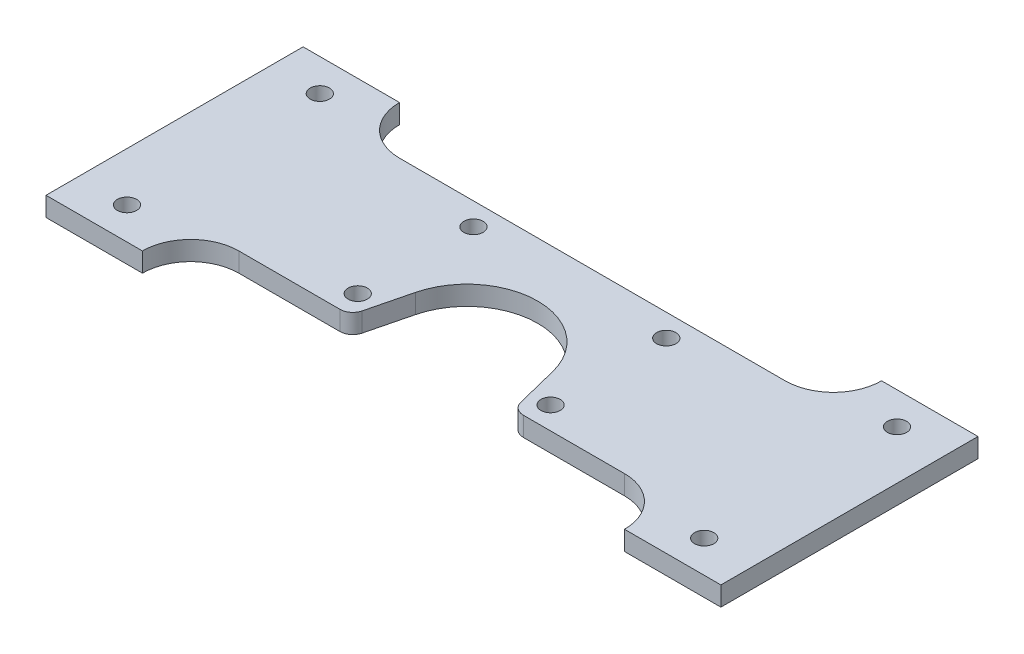
ISO-10303-21;
HEADER;
FILE_DESCRIPTION(('STEP AP214'),'2;1');
FILE_NAME('part.step','',(''),(''),'','','');
FILE_SCHEMA(('AUTOMOTIVE_DESIGN { 1 0 10303 214 1 1 1 1 }'));
ENDSEC;
DATA;
#1=APPLICATION_CONTEXT('core data for automotive mechanical design processes');
#2=APPLICATION_PROTOCOL_DEFINITION('international standard','automotive_design',2000,#1);
#3=PRODUCT_CONTEXT('',#1,'mechanical');
#4=PRODUCT('Part','Part','',(#3));
#5=PRODUCT_RELATED_PRODUCT_CATEGORY('part','',(#4));
#6=PRODUCT_DEFINITION_FORMATION('','',#4);
#7=PRODUCT_DEFINITION_CONTEXT('part definition',#1,'design');
#8=PRODUCT_DEFINITION('design','',#6,#7);
#9=PRODUCT_DEFINITION_SHAPE('','',#8);
#10=(LENGTH_UNIT() NAMED_UNIT(*) SI_UNIT(.MILLI.,.METRE.));
#11=(NAMED_UNIT(*) PLANE_ANGLE_UNIT() SI_UNIT($,.RADIAN.));
#12=(NAMED_UNIT(*) SI_UNIT($,.STERADIAN.) SOLID_ANGLE_UNIT());
#13=UNCERTAINTY_MEASURE_WITH_UNIT(LENGTH_MEASURE(1.E-05),#10,'distance_accuracy_value','');
#14=(GEOMETRIC_REPRESENTATION_CONTEXT(3) GLOBAL_UNCERTAINTY_ASSIGNED_CONTEXT((#13)) GLOBAL_UNIT_ASSIGNED_CONTEXT((#10,
#11,#12)) REPRESENTATION_CONTEXT('',''));
#15=CARTESIAN_POINT('',(0.,0.,0.));
#16=DIRECTION('',(0.,0.,1.));
#17=DIRECTION('',(1.,0.,0.));
#18=AXIS2_PLACEMENT_3D('',#15,#16,#17);
#19=CARTESIAN_POINT('',(-30.0000000000001,3.,-20.));
#20=DIRECTION('',(0.,1.,0.));
#21=DIRECTION('',(0.,0.,1.));
#22=AXIS2_PLACEMENT_3D('',#19,#20,#21);
#23=PLANE('',#22);
#24=CARTESIAN_POINT('',(-15.,3.,-9.));
#25=DIRECTION('',(0.,1.,0.));
#26=DIRECTION('',(0.,0.,1.));
#27=AXIS2_PLACEMENT_3D('',#24,#25,#26);
#28=CIRCLE('',#27,1.5);
#29=CARTESIAN_POINT('',(-15.,3.,-7.5));
#30=VERTEX_POINT('',#29);
#31=EDGE_CURVE('E348',#30,#30,#28,.T.);
#32=ORIENTED_EDGE('',*,*,#31,.F.);
#33=EDGE_LOOP('',(#32));
#34=FACE_BOUND('',#33,.T.);
#35=CARTESIAN_POINT('',(15.,3.,-9.));
#36=DIRECTION('',(0.,1.,0.));
#37=DIRECTION('',(0.,0.,1.));
#38=AXIS2_PLACEMENT_3D('',#35,#36,#37);
#39=CIRCLE('',#38,1.5);
#40=CARTESIAN_POINT('',(15.,3.,-7.5));
#41=VERTEX_POINT('',#40);
#42=EDGE_CURVE('E336',#41,#41,#39,.T.);
#43=ORIENTED_EDGE('',*,*,#42,.F.);
#44=EDGE_LOOP('',(#43));
#45=FACE_BOUND('',#44,.T.);
#46=CARTESIAN_POINT('',(44.9012806053458,3.,15.));
#47=DIRECTION('',(0.,1.,0.));
#48=DIRECTION('',(0.,0.,1.));
#49=AXIS2_PLACEMENT_3D('',#46,#47,#48);
#50=CIRCLE('',#49,1.5);
#51=CARTESIAN_POINT('',(44.9012806053458,3.,16.5));
#52=VERTEX_POINT('',#51);
#53=EDGE_CURVE('E324',#52,#52,#50,.T.);
#54=ORIENTED_EDGE('',*,*,#53,.F.);
#55=EDGE_LOOP('',(#54));
#56=FACE_BOUND('',#55,.T.);
#57=CARTESIAN_POINT('',(-44.9012806053458,3.,-15.));
#58=DIRECTION('',(0.,1.,0.));
#59=DIRECTION('',(0.,0.,1.));
#60=AXIS2_PLACEMENT_3D('',#57,#58,#59);
#61=CIRCLE('',#60,1.5);
#62=CARTESIAN_POINT('',(-44.9012806053458,3.,-13.5));
#63=VERTEX_POINT('',#62);
#64=EDGE_CURVE('E290',#63,#63,#61,.T.);
#65=ORIENTED_EDGE('',*,*,#64,.F.);
#66=EDGE_LOOP('',(#65));
#67=FACE_BOUND('',#66,.T.);
#68=DIRECTION('',(0.241921895599665,0.,0.970295726275997));
#69=VECTOR('',#68,1.);
#70=CARTESIAN_POINT('',(10.673252989036,3.,4.33885914840369));
#71=LINE('',#70,#69);
#72=CARTESIAN_POINT('',(10.673252989036,3.,4.33885914840368));
#73=VERTEX_POINT('',#72);
#74=CARTESIAN_POINT('',(12.3300337389478,3.,10.9838437911993));
#75=VERTEX_POINT('',#74);
#76=EDGE_CURVE('E306',#73,#75,#71,.T.);
#77=ORIENTED_EDGE('',*,*,#76,.T.);
#78=CARTESIAN_POINT('',(14.2706251914998,3.,10.5));
#79=DIRECTION('',(0.,1.,0.));
#80=DIRECTION('',(0.,0.,1.));
#81=AXIS2_PLACEMENT_3D('',#78,#79,#80);
#82=CIRCLE('',#81,2.);
#83=CARTESIAN_POINT('',(14.2706251914998,3.,12.5));
#84=VERTEX_POINT('',#83);
#85=EDGE_CURVE('E200',#75,#84,#82,.T.);
#86=ORIENTED_EDGE('',*,*,#85,.T.);
#87=DIRECTION('',(1.,0.,0.));
#88=VECTOR('',#87,1.);
#89=CARTESIAN_POINT('',(12.7080539384863,3.,12.5));
#90=LINE('',#89,#88);
#91=CARTESIAN_POINT('',(30.0000000000001,3.,12.5));
#92=VERTEX_POINT('',#91);
#93=EDGE_CURVE('E304',#84,#92,#90,.T.);
#94=ORIENTED_EDGE('',*,*,#93,.T.);
#95=CARTESIAN_POINT('',(30.0000000000001,3.,19.9999999999999));
#96=DIRECTION('',(0.,-1.,0.));
#97=DIRECTION('',(0.,0.,-1.));
#98=AXIS2_PLACEMENT_3D('',#95,#96,#97);
#99=CIRCLE('',#98,7.49999999999992);
#100=CARTESIAN_POINT('',(37.5,3.,19.9999999999999));
#101=VERTEX_POINT('',#100);
#102=EDGE_CURVE('E302',#92,#101,#99,.T.);
#103=ORIENTED_EDGE('',*,*,#102,.T.);
#104=DIRECTION('',(1.,0.,0.));
#105=VECTOR('',#104,1.);
#106=CARTESIAN_POINT('',(37.5,3.,19.9999999999999));
#107=LINE('',#106,#105);
#108=CARTESIAN_POINT('',(52.5,3.,20.));
#109=VERTEX_POINT('',#108);
#110=EDGE_CURVE('E300',#101,#109,#107,.T.);
#111=ORIENTED_EDGE('',*,*,#110,.T.);
#112=DIRECTION('',(0.,0.,-1.));
#113=VECTOR('',#112,1.);
#114=CARTESIAN_POINT('',(52.5,3.,20.));
#115=LINE('',#114,#113);
#116=CARTESIAN_POINT('',(52.5,3.,-20.0000000000001));
#117=VERTEX_POINT('',#116);
#118=EDGE_CURVE('E298',#109,#117,#115,.T.);
#119=ORIENTED_EDGE('',*,*,#118,.T.);
#120=DIRECTION('',(-1.,0.,0.));
#121=VECTOR('',#120,1.);
#122=CARTESIAN_POINT('',(37.5,3.,-19.9999999999999));
#123=LINE('',#122,#121);
#124=CARTESIAN_POINT('',(37.5,3.,-19.9999999999999));
#125=VERTEX_POINT('',#124);
#126=EDGE_CURVE('E296',#117,#125,#123,.T.);
#127=ORIENTED_EDGE('',*,*,#126,.T.);
#128=CARTESIAN_POINT('',(30.0000000000001,3.,-19.9999999999999));
#129=DIRECTION('',(0.,-1.,0.));
#130=DIRECTION('',(0.,0.,1.));
#131=AXIS2_PLACEMENT_3D('',#128,#129,#130);
#132=CIRCLE('',#131,7.49999999999995);
#133=CARTESIAN_POINT('',(30.0000000000001,3.,-12.5));
#134=VERTEX_POINT('',#133);
#135=EDGE_CURVE('E294',#125,#134,#132,.T.);
#136=ORIENTED_EDGE('',*,*,#135,.T.);
#137=DIRECTION('',(-1.,0.,0.));
#138=VECTOR('',#137,1.);
#139=CARTESIAN_POINT('',(-30.0000000000001,3.,-12.5));
#140=LINE('',#139,#138);
#141=CARTESIAN_POINT('',(-30.0000000000001,3.,-12.5));
#142=VERTEX_POINT('',#141);
#143=EDGE_CURVE('E292',#134,#142,#140,.T.);
#144=ORIENTED_EDGE('',*,*,#143,.T.);
#145=CARTESIAN_POINT('',(-30.0000000000001,3.,-20.));
#146=DIRECTION('',(0.,-1.,0.));
#147=DIRECTION('',(0.,0.,1.));
#148=AXIS2_PLACEMENT_3D('',#145,#146,#147);
#149=CIRCLE('',#148,7.49999999999997);
#150=CARTESIAN_POINT('',(-37.5000000000001,3.,-19.9999999999999));
#151=VERTEX_POINT('',#150);
#152=EDGE_CURVE('E176',#142,#151,#149,.T.);
#153=ORIENTED_EDGE('',*,*,#152,.T.);
#154=DIRECTION('',(-1.,0.,0.));
#155=VECTOR('',#154,1.);
#156=CARTESIAN_POINT('',(-52.5,3.,-20.0000000000001));
#157=LINE('',#156,#155);
#158=CARTESIAN_POINT('',(-52.5,3.,-20.0000000000001));
#159=VERTEX_POINT('',#158);
#160=EDGE_CURVE('E170',#151,#159,#157,.T.);
#161=ORIENTED_EDGE('',*,*,#160,.T.);
#162=DIRECTION('',(0.,0.,1.));
#163=VECTOR('',#162,1.);
#164=CARTESIAN_POINT('',(-52.5,3.,-20.0000000000001));
#165=LINE('',#164,#163);
#166=CARTESIAN_POINT('',(-52.5,3.,19.9999999999999));
#167=VERTEX_POINT('',#166);
#168=EDGE_CURVE('E160',#159,#167,#165,.T.);
#169=ORIENTED_EDGE('',*,*,#168,.T.);
#170=DIRECTION('',(1.,0.,0.));
#171=VECTOR('',#170,1.);
#172=CARTESIAN_POINT('',(-52.5,3.,19.9999999999999));
#173=LINE('',#172,#171);
#174=CARTESIAN_POINT('',(-37.5,3.,19.9999999999999));
#175=VERTEX_POINT('',#174);
#176=EDGE_CURVE('E169',#167,#175,#173,.T.);
#177=ORIENTED_EDGE('',*,*,#176,.T.);
#178=CARTESIAN_POINT('',(-30.0000000000001,3.,19.9999999999999));
#179=DIRECTION('',(0.,-1.,0.));
#180=DIRECTION('',(0.,0.,-1.));
#181=AXIS2_PLACEMENT_3D('',#178,#179,#180);
#182=CIRCLE('',#181,7.49999999999992);
#183=CARTESIAN_POINT('',(-30.0000000000001,3.,12.5));
#184=VERTEX_POINT('',#183);
#185=EDGE_CURVE('E281',#175,#184,#182,.T.);
#186=ORIENTED_EDGE('',*,*,#185,.T.);
#187=DIRECTION('',(1.,0.,0.));
#188=VECTOR('',#187,1.);
#189=CARTESIAN_POINT('',(-30.0000000000001,3.,12.5));
#190=LINE('',#189,#188);
#191=CARTESIAN_POINT('',(-14.2706251914998,3.,12.5));
#192=VERTEX_POINT('',#191);
#193=EDGE_CURVE('E311',#184,#192,#190,.T.);
#194=ORIENTED_EDGE('',*,*,#193,.T.);
#195=CARTESIAN_POINT('',(-14.2706251914998,3.,10.5));
#196=DIRECTION('',(0.,1.,0.));
#197=DIRECTION('',(0.,0.,1.));
#198=AXIS2_PLACEMENT_3D('',#195,#196,#197);
#199=CIRCLE('',#198,2.);
#200=CARTESIAN_POINT('',(-12.3300337389478,3.,10.9838437911993));
#201=VERTEX_POINT('',#200);
#202=EDGE_CURVE('E50',#192,#201,#199,.T.);
#203=ORIENTED_EDGE('',*,*,#202,.T.);
#204=DIRECTION('',(0.241921895599665,0.,-0.970295726275997));
#205=VECTOR('',#204,1.);
#206=CARTESIAN_POINT('',(-12.7080539384863,3.,12.5));
#207=LINE('',#206,#205);
#208=CARTESIAN_POINT('',(-10.673252989036,3.,4.33885914840369));
#209=VERTEX_POINT('',#208);
#210=EDGE_CURVE('E209',#201,#209,#207,.T.);
#211=ORIENTED_EDGE('',*,*,#210,.T.);
#212=CARTESIAN_POINT('',(0.,3.,7.));
#213=DIRECTION('',(0.,-1.,0.));
#214=DIRECTION('',(0.,0.,-1.));
#215=AXIS2_PLACEMENT_3D('',#212,#213,#214);
#216=CIRCLE('',#215,11.);
#217=EDGE_CURVE('E308',#209,#73,#216,.T.);
#218=ORIENTED_EDGE('',*,*,#217,.T.);
#219=EDGE_LOOP('',(#77,#86,#94,#103,#111,#119,#127,#136,#144,#153,#161,#169,#177,#186,#194,#203,
#211,#218));
#220=FACE_BOUND('',#219,.T.);
#221=CARTESIAN_POINT('',(-44.9012806053458,3.,15.));
#222=DIRECTION('',(0.,1.,0.));
#223=DIRECTION('',(0.,0.,1.));
#224=AXIS2_PLACEMENT_3D('',#221,#222,#223);
#225=CIRCLE('',#224,1.5);
#226=CARTESIAN_POINT('',(-44.9012806053458,3.,16.5));
#227=VERTEX_POINT('',#226);
#228=EDGE_CURVE('E318',#227,#227,#225,.T.);
#229=ORIENTED_EDGE('',*,*,#228,.F.);
#230=EDGE_LOOP('',(#229));
#231=FACE_BOUND('',#230,.T.);
#232=CARTESIAN_POINT('',(44.9012806053458,3.,-15.));
#233=DIRECTION('',(0.,1.,0.));
#234=DIRECTION('',(0.,0.,1.));
#235=AXIS2_PLACEMENT_3D('',#232,#233,#234);
#236=CIRCLE('',#235,1.5);
#237=CARTESIAN_POINT('',(44.9012806053458,3.,-13.5));
#238=VERTEX_POINT('',#237);
#239=EDGE_CURVE('E330',#238,#238,#236,.T.);
#240=ORIENTED_EDGE('',*,*,#239,.F.);
#241=EDGE_LOOP('',(#240));
#242=FACE_BOUND('',#241,.T.);
#243=CARTESIAN_POINT('',(15.,3.,9.));
#244=DIRECTION('',(0.,1.,0.));
#245=DIRECTION('',(0.,0.,1.));
#246=AXIS2_PLACEMENT_3D('',#243,#244,#245);
#247=CIRCLE('',#246,1.5);
#248=CARTESIAN_POINT('',(15.,3.,10.5));
#249=VERTEX_POINT('',#248);
#250=EDGE_CURVE('E342',#249,#249,#247,.T.);
#251=ORIENTED_EDGE('',*,*,#250,.F.);
#252=EDGE_LOOP('',(#251));
#253=FACE_BOUND('',#252,.T.);
#254=CARTESIAN_POINT('',(-15.,3.,9.));
#255=DIRECTION('',(0.,1.,0.));
#256=DIRECTION('',(0.,0.,1.));
#257=AXIS2_PLACEMENT_3D('',#254,#255,#256);
#258=CIRCLE('',#257,1.5);
#259=CARTESIAN_POINT('',(-15.,3.,10.5));
#260=VERTEX_POINT('',#259);
#261=EDGE_CURVE('E354',#260,#260,#258,.T.);
#262=ORIENTED_EDGE('',*,*,#261,.F.);
#263=EDGE_LOOP('',(#262));
#264=FACE_BOUND('',#263,.T.);
#265=ADVANCED_FACE('F35',(#34,#45,#56,#67,#220,#231,#242,#253,#264),#23,.T.);
#266=CARTESIAN_POINT('',(-30.0000000000001,0.,-20.));
#267=DIRECTION('',(0.,1.,0.));
#268=DIRECTION('',(0.,0.,1.));
#269=AXIS2_PLACEMENT_3D('',#266,#267,#268);
#270=PLANE('',#269);
#271=DIRECTION('',(1.,0.,0.));
#272=VECTOR('',#271,1.);
#273=CARTESIAN_POINT('',(12.7080539384863,0.,12.5));
#274=LINE('',#273,#272);
#275=CARTESIAN_POINT('',(14.2706251914998,0.,12.5));
#276=VERTEX_POINT('',#275);
#277=CARTESIAN_POINT('',(30.0000000000001,0.,12.5));
#278=VERTEX_POINT('',#277);
#279=EDGE_CURVE('E229',#276,#278,#274,.T.);
#280=ORIENTED_EDGE('',*,*,#279,.F.);
#281=CARTESIAN_POINT('',(14.2706251914998,0.,10.5));
#282=DIRECTION('',(0.,1.,0.));
#283=DIRECTION('',(0.,0.,1.));
#284=AXIS2_PLACEMENT_3D('',#281,#282,#283);
#285=CIRCLE('',#284,2.);
#286=CARTESIAN_POINT('',(12.3300337389478,0.,10.9838437911993));
#287=VERTEX_POINT('',#286);
#288=EDGE_CURVE('E195',#276,#287,#285,.F.);
#289=ORIENTED_EDGE('',*,*,#288,.T.);
#290=DIRECTION('',(0.241921895599665,0.,0.970295726275997));
#291=VECTOR('',#290,1.);
#292=CARTESIAN_POINT('',(10.673252989036,0.,4.33885914840369));
#293=LINE('',#292,#291);
#294=CARTESIAN_POINT('',(10.673252989036,0.,4.33885914840368));
#295=VERTEX_POINT('',#294);
#296=EDGE_CURVE('E221',#295,#287,#293,.T.);
#297=ORIENTED_EDGE('',*,*,#296,.F.);
#298=CARTESIAN_POINT('',(0.,0.,7.));
#299=DIRECTION('',(0.,-1.,0.));
#300=DIRECTION('',(0.,0.,-1.));
#301=AXIS2_PLACEMENT_3D('',#298,#299,#300);
#302=CIRCLE('',#301,11.);
#303=CARTESIAN_POINT('',(-10.673252989036,0.,4.33885914840369));
#304=VERTEX_POINT('',#303);
#305=EDGE_CURVE('E218',#304,#295,#302,.T.);
#306=ORIENTED_EDGE('',*,*,#305,.F.);
#307=DIRECTION('',(0.241921895599665,0.,-0.970295726275997));
#308=VECTOR('',#307,1.);
#309=CARTESIAN_POINT('',(-12.7080539384863,0.,12.5));
#310=LINE('',#309,#308);
#311=CARTESIAN_POINT('',(-12.3300337389478,0.,10.9838437911993));
#312=VERTEX_POINT('',#311);
#313=EDGE_CURVE('E207',#312,#304,#310,.T.);
#314=ORIENTED_EDGE('',*,*,#313,.F.);
#315=CARTESIAN_POINT('',(-14.2706251914998,0.,10.5));
#316=DIRECTION('',(0.,1.,0.));
#317=DIRECTION('',(0.,0.,1.));
#318=AXIS2_PLACEMENT_3D('',#315,#316,#317);
#319=CIRCLE('',#318,2.);
#320=CARTESIAN_POINT('',(-14.2706251914998,0.,12.5));
#321=VERTEX_POINT('',#320);
#322=EDGE_CURVE('E188',#312,#321,#319,.F.);
#323=ORIENTED_EDGE('',*,*,#322,.T.);
#324=DIRECTION('',(1.,0.,0.));
#325=VECTOR('',#324,1.);
#326=CARTESIAN_POINT('',(-30.0000000000001,0.,12.5));
#327=LINE('',#326,#325);
#328=CARTESIAN_POINT('',(-30.0000000000001,0.,12.5));
#329=VERTEX_POINT('',#328);
#330=EDGE_CURVE('E219',#329,#321,#327,.T.);
#331=ORIENTED_EDGE('',*,*,#330,.F.);
#332=CARTESIAN_POINT('',(-30.0000000000001,0.,19.9999999999999));
#333=DIRECTION('',(0.,-1.,0.));
#334=DIRECTION('',(0.,0.,-1.));
#335=AXIS2_PLACEMENT_3D('',#332,#333,#334);
#336=CIRCLE('',#335,7.49999999999992);
#337=CARTESIAN_POINT('',(-37.5,0.,19.9999999999999));
#338=VERTEX_POINT('',#337);
#339=EDGE_CURVE('E223',#338,#329,#336,.T.);
#340=ORIENTED_EDGE('',*,*,#339,.F.);
#341=DIRECTION('',(1.,0.,0.));
#342=VECTOR('',#341,1.);
#343=CARTESIAN_POINT('',(-52.5,0.,19.9999999999999));
#344=LINE('',#343,#342);
#345=CARTESIAN_POINT('',(-52.5,0.,19.9999999999999));
#346=VERTEX_POINT('',#345);
#347=EDGE_CURVE('E284',#346,#338,#344,.T.);
#348=ORIENTED_EDGE('',*,*,#347,.F.);
#349=DIRECTION('',(0.,0.,1.));
#350=VECTOR('',#349,1.);
#351=CARTESIAN_POINT('',(-52.5,0.,-20.0000000000001));
#352=LINE('',#351,#350);
#353=CARTESIAN_POINT('',(-52.5,0.,-20.0000000000001));
#354=VERTEX_POINT('',#353);
#355=EDGE_CURVE('E285',#354,#346,#352,.T.);
#356=ORIENTED_EDGE('',*,*,#355,.F.);
#357=DIRECTION('',(-1.,0.,0.));
#358=VECTOR('',#357,1.);
#359=CARTESIAN_POINT('',(-52.5,0.,-20.0000000000001));
#360=LINE('',#359,#358);
#361=CARTESIAN_POINT('',(-37.5000000000001,0.,-19.9999999999999));
#362=VERTEX_POINT('',#361);
#363=EDGE_CURVE('E184',#362,#354,#360,.T.);
#364=ORIENTED_EDGE('',*,*,#363,.F.);
#365=CARTESIAN_POINT('',(-30.0000000000001,0.,-20.));
#366=DIRECTION('',(0.,-1.,0.));
#367=DIRECTION('',(0.,0.,1.));
#368=AXIS2_PLACEMENT_3D('',#365,#366,#367);
#369=CIRCLE('',#368,7.49999999999997);
#370=CARTESIAN_POINT('',(-30.0000000000001,0.,-12.5));
#371=VERTEX_POINT('',#370);
#372=EDGE_CURVE('E180',#371,#362,#369,.T.);
#373=ORIENTED_EDGE('',*,*,#372,.F.);
#374=DIRECTION('',(-1.,0.,0.));
#375=VECTOR('',#374,1.);
#376=CARTESIAN_POINT('',(-30.0000000000001,0.,-12.5));
#377=LINE('',#376,#375);
#378=CARTESIAN_POINT('',(30.0000000000001,0.,-12.5));
#379=VERTEX_POINT('',#378);
#380=EDGE_CURVE('E241',#379,#371,#377,.T.);
#381=ORIENTED_EDGE('',*,*,#380,.F.);
#382=CARTESIAN_POINT('',(30.0000000000001,0.,-19.9999999999999));
#383=DIRECTION('',(0.,-1.,0.));
#384=DIRECTION('',(0.,0.,1.));
#385=AXIS2_PLACEMENT_3D('',#382,#383,#384);
#386=CIRCLE('',#385,7.49999999999995);
#387=CARTESIAN_POINT('',(37.5,0.,-19.9999999999999));
#388=VERTEX_POINT('',#387);
#389=EDGE_CURVE('E239',#388,#379,#386,.T.);
#390=ORIENTED_EDGE('',*,*,#389,.F.);
#391=DIRECTION('',(-1.,0.,0.));
#392=VECTOR('',#391,1.);
#393=CARTESIAN_POINT('',(37.5,0.,-19.9999999999999));
#394=LINE('',#393,#392);
#395=CARTESIAN_POINT('',(52.5,0.,-20.0000000000001));
#396=VERTEX_POINT('',#395);
#397=EDGE_CURVE('E237',#396,#388,#394,.T.);
#398=ORIENTED_EDGE('',*,*,#397,.F.);
#399=DIRECTION('',(0.,0.,-1.));
#400=VECTOR('',#399,1.);
#401=CARTESIAN_POINT('',(52.5,0.,20.));
#402=LINE('',#401,#400);
#403=CARTESIAN_POINT('',(52.5,0.,20.));
#404=VERTEX_POINT('',#403);
#405=EDGE_CURVE('E235',#404,#396,#402,.T.);
#406=ORIENTED_EDGE('',*,*,#405,.F.);
#407=DIRECTION('',(1.,0.,0.));
#408=VECTOR('',#407,1.);
#409=CARTESIAN_POINT('',(37.5,0.,19.9999999999999));
#410=LINE('',#409,#408);
#411=CARTESIAN_POINT('',(37.5,0.,19.9999999999999));
#412=VERTEX_POINT('',#411);
#413=EDGE_CURVE('E233',#412,#404,#410,.T.);
#414=ORIENTED_EDGE('',*,*,#413,.F.);
#415=CARTESIAN_POINT('',(30.0000000000001,0.,19.9999999999999));
#416=DIRECTION('',(0.,-1.,0.));
#417=DIRECTION('',(0.,0.,-1.));
#418=AXIS2_PLACEMENT_3D('',#415,#416,#417);
#419=CIRCLE('',#418,7.49999999999992);
#420=EDGE_CURVE('E231',#278,#412,#419,.T.);
#421=ORIENTED_EDGE('',*,*,#420,.F.);
#422=EDGE_LOOP('',(#280,#289,#297,#306,#314,#323,#331,#340,#348,#356,#364,#373,#381,#390,#398,
#406,#414,#421));
#423=FACE_BOUND('',#422,.T.);
#424=CARTESIAN_POINT('',(-44.9012806053458,0.,-15.));
#425=DIRECTION('',(0.,1.,0.));
#426=DIRECTION('',(0.,0.,1.));
#427=AXIS2_PLACEMENT_3D('',#424,#425,#426);
#428=CIRCLE('',#427,1.5);
#429=CARTESIAN_POINT('',(-44.9012806053458,0.,-13.5));
#430=VERTEX_POINT('',#429);
#431=EDGE_CURVE('E315',#430,#430,#428,.T.);
#432=ORIENTED_EDGE('',*,*,#431,.T.);
#433=EDGE_LOOP('',(#432));
#434=FACE_BOUND('',#433,.T.);
#435=CARTESIAN_POINT('',(-44.9012806053458,0.,15.));
#436=DIRECTION('',(0.,1.,0.));
#437=DIRECTION('',(0.,0.,1.));
#438=AXIS2_PLACEMENT_3D('',#435,#436,#437);
#439=CIRCLE('',#438,1.5);
#440=CARTESIAN_POINT('',(-44.9012806053458,0.,16.5));
#441=VERTEX_POINT('',#440);
#442=EDGE_CURVE('E321',#441,#441,#439,.T.);
#443=ORIENTED_EDGE('',*,*,#442,.T.);
#444=EDGE_LOOP('',(#443));
#445=FACE_BOUND('',#444,.T.);
#446=CARTESIAN_POINT('',(44.9012806053458,0.,15.));
#447=DIRECTION('',(0.,1.,0.));
#448=DIRECTION('',(0.,0.,1.));
#449=AXIS2_PLACEMENT_3D('',#446,#447,#448);
#450=CIRCLE('',#449,1.5);
#451=CARTESIAN_POINT('',(44.9012806053458,0.,16.5));
#452=VERTEX_POINT('',#451);
#453=EDGE_CURVE('E327',#452,#452,#450,.T.);
#454=ORIENTED_EDGE('',*,*,#453,.T.);
#455=EDGE_LOOP('',(#454));
#456=FACE_BOUND('',#455,.T.);
#457=CARTESIAN_POINT('',(44.9012806053458,0.,-15.));
#458=DIRECTION('',(0.,1.,0.));
#459=DIRECTION('',(0.,0.,1.));
#460=AXIS2_PLACEMENT_3D('',#457,#458,#459);
#461=CIRCLE('',#460,1.5);
#462=CARTESIAN_POINT('',(44.9012806053458,0.,-13.5));
#463=VERTEX_POINT('',#462);
#464=EDGE_CURVE('E333',#463,#463,#461,.T.);
#465=ORIENTED_EDGE('',*,*,#464,.T.);
#466=EDGE_LOOP('',(#465));
#467=FACE_BOUND('',#466,.T.);
#468=CARTESIAN_POINT('',(15.,0.,-9.));
#469=DIRECTION('',(0.,1.,0.));
#470=DIRECTION('',(0.,0.,1.));
#471=AXIS2_PLACEMENT_3D('',#468,#469,#470);
#472=CIRCLE('',#471,1.5);
#473=CARTESIAN_POINT('',(15.,0.,-7.5));
#474=VERTEX_POINT('',#473);
#475=EDGE_CURVE('E339',#474,#474,#472,.T.);
#476=ORIENTED_EDGE('',*,*,#475,.T.);
#477=EDGE_LOOP('',(#476));
#478=FACE_BOUND('',#477,.T.);
#479=CARTESIAN_POINT('',(15.,0.,9.));
#480=DIRECTION('',(0.,1.,0.));
#481=DIRECTION('',(0.,0.,1.));
#482=AXIS2_PLACEMENT_3D('',#479,#480,#481);
#483=CIRCLE('',#482,1.5);
#484=CARTESIAN_POINT('',(15.,0.,10.5));
#485=VERTEX_POINT('',#484);
#486=EDGE_CURVE('E345',#485,#485,#483,.T.);
#487=ORIENTED_EDGE('',*,*,#486,.T.);
#488=EDGE_LOOP('',(#487));
#489=FACE_BOUND('',#488,.T.);
#490=CARTESIAN_POINT('',(-15.,0.,-9.));
#491=DIRECTION('',(0.,1.,0.));
#492=DIRECTION('',(0.,0.,1.));
#493=AXIS2_PLACEMENT_3D('',#490,#491,#492);
#494=CIRCLE('',#493,1.5);
#495=CARTESIAN_POINT('',(-15.,0.,-7.5));
#496=VERTEX_POINT('',#495);
#497=EDGE_CURVE('E351',#496,#496,#494,.T.);
#498=ORIENTED_EDGE('',*,*,#497,.T.);
#499=EDGE_LOOP('',(#498));
#500=FACE_BOUND('',#499,.T.);
#501=CARTESIAN_POINT('',(-15.,0.,9.));
#502=DIRECTION('',(0.,1.,0.));
#503=DIRECTION('',(0.,0.,1.));
#504=AXIS2_PLACEMENT_3D('',#501,#502,#503);
#505=CIRCLE('',#504,1.5);
#506=CARTESIAN_POINT('',(-15.,0.,10.5));
#507=VERTEX_POINT('',#506);
#508=EDGE_CURVE('E357',#507,#507,#505,.T.);
#509=ORIENTED_EDGE('',*,*,#508,.T.);
#510=EDGE_LOOP('',(#509));
#511=FACE_BOUND('',#510,.T.);
#512=ADVANCED_FACE('F214',(#423,#434,#445,#456,#467,#478,#489,#500,#511),#270,.F.);
#513=CARTESIAN_POINT('',(-52.5,3.,-20.0000000000001));
#514=DIRECTION('',(0.,0.,1.));
#515=DIRECTION('',(1.,0.,0.));
#516=AXIS2_PLACEMENT_3D('',#513,#514,#515);
#517=PLANE('',#516);
#518=ORIENTED_EDGE('',*,*,#363,.T.);
#519=DIRECTION('',(0.,-1.,0.));
#520=VECTOR('',#519,1.);
#521=CARTESIAN_POINT('',(-52.5,3.,-20.0000000000001));
#522=LINE('',#521,#520);
#523=EDGE_CURVE('E164',#159,#354,#522,.T.);
#524=ORIENTED_EDGE('',*,*,#523,.F.);
#525=ORIENTED_EDGE('',*,*,#160,.F.);
#526=DIRECTION('',(0.,-1.,0.));
#527=VECTOR('',#526,1.);
#528=CARTESIAN_POINT('',(-37.5000000000001,3.,-19.9999999999999));
#529=LINE('',#528,#527);
#530=EDGE_CURVE('E244',#151,#362,#529,.T.);
#531=ORIENTED_EDGE('',*,*,#530,.T.);
#532=EDGE_LOOP('',(#518,#524,#525,#531));
#533=FACE_BOUND('',#532,.T.);
#534=ADVANCED_FACE('F182',(#533),#517,.F.);
#535=CARTESIAN_POINT('',(-52.5,3.,-20.0000000000001));
#536=DIRECTION('',(1.,0.,0.));
#537=DIRECTION('',(0.,0.,-1.));
#538=AXIS2_PLACEMENT_3D('',#535,#536,#537);
#539=PLANE('',#538);
#540=ORIENTED_EDGE('',*,*,#355,.T.);
#541=DIRECTION('',(0.,-1.,0.));
#542=VECTOR('',#541,1.);
#543=CARTESIAN_POINT('',(-52.5,3.,19.9999999999999));
#544=LINE('',#543,#542);
#545=EDGE_CURVE('E167',#167,#346,#544,.T.);
#546=ORIENTED_EDGE('',*,*,#545,.F.);
#547=ORIENTED_EDGE('',*,*,#168,.F.);
#548=ORIENTED_EDGE('',*,*,#523,.T.);
#549=EDGE_LOOP('',(#540,#546,#547,#548));
#550=FACE_BOUND('',#549,.T.);
#551=ADVANCED_FACE('F162',(#550),#539,.F.);
#552=CARTESIAN_POINT('',(-52.5,3.,19.9999999999999));
#553=DIRECTION('',(0.,0.,-1.));
#554=DIRECTION('',(-1.,0.,0.));
#555=AXIS2_PLACEMENT_3D('',#552,#553,#554);
#556=PLANE('',#555);
#557=ORIENTED_EDGE('',*,*,#347,.T.);
#558=DIRECTION('',(0.,-1.,0.));
#559=VECTOR('',#558,1.);
#560=CARTESIAN_POINT('',(-37.5,3.,19.9999999999999));
#561=LINE('',#560,#559);
#562=EDGE_CURVE('E190',#175,#338,#561,.T.);
#563=ORIENTED_EDGE('',*,*,#562,.F.);
#564=ORIENTED_EDGE('',*,*,#176,.F.);
#565=ORIENTED_EDGE('',*,*,#545,.T.);
#566=EDGE_LOOP('',(#557,#563,#564,#565));
#567=FACE_BOUND('',#566,.T.);
#568=ADVANCED_FACE('F427',(#567),#556,.F.);
#569=CARTESIAN_POINT('',(-30.0000000000001,3.,19.9999999999999));
#570=DIRECTION('',(0.,-1.,0.));
#571=DIRECTION('',(0.,0.,-1.));
#572=AXIS2_PLACEMENT_3D('',#569,#570,#571);
#573=CYLINDRICAL_SURFACE('',#572,7.49999999999992);
#574=ORIENTED_EDGE('',*,*,#339,.T.);
#575=DIRECTION('',(0.,-1.,0.));
#576=VECTOR('',#575,1.);
#577=CARTESIAN_POINT('',(-30.0000000000001,3.,12.5));
#578=LINE('',#577,#576);
#579=EDGE_CURVE('E272',#184,#329,#578,.T.);
#580=ORIENTED_EDGE('',*,*,#579,.F.);
#581=ORIENTED_EDGE('',*,*,#185,.F.);
#582=ORIENTED_EDGE('',*,*,#562,.T.);
#583=EDGE_LOOP('',(#574,#580,#581,#582));
#584=FACE_BOUND('',#583,.T.);
#585=ADVANCED_FACE('F279',(#584),#573,.F.);
#586=CARTESIAN_POINT('',(-30.0000000000001,3.,12.5));
#587=DIRECTION('',(0.,0.,-1.));
#588=DIRECTION('',(-1.,0.,0.));
#589=AXIS2_PLACEMENT_3D('',#586,#587,#588);
#590=PLANE('',#589);
#591=ORIENTED_EDGE('',*,*,#330,.T.);
#592=DIRECTION('',(0.,-1.,0.));
#593=VECTOR('',#592,1.);
#594=CARTESIAN_POINT('',(-14.2706251914998,3.,12.5));
#595=LINE('',#594,#593);
#596=EDGE_CURVE('E11',#321,#192,#595,.F.);
#597=ORIENTED_EDGE('',*,*,#596,.T.);
#598=ORIENTED_EDGE('',*,*,#193,.F.);
#599=ORIENTED_EDGE('',*,*,#579,.T.);
#600=EDGE_LOOP('',(#591,#597,#598,#599));
#601=FACE_BOUND('',#600,.T.);
#602=ADVANCED_FACE('F422',(#601),#590,.F.);
#603=CARTESIAN_POINT('',(-12.7080539384863,3.,12.5));
#604=DIRECTION('',(-0.970295726275997,0.,-0.241921895599665));
#605=DIRECTION('',(-0.241921895599665,0.,0.970295726275997));
#606=AXIS2_PLACEMENT_3D('',#603,#604,#605);
#607=PLANE('',#606);
#608=ORIENTED_EDGE('',*,*,#210,.F.);
#609=DIRECTION('',(0.,-1.,0.));
#610=VECTOR('',#609,1.);
#611=CARTESIAN_POINT('',(-12.3300337389478,3.,10.9838437911993));
#612=LINE('',#611,#610);
#613=EDGE_CURVE('E43',#201,#312,#612,.T.);
#614=ORIENTED_EDGE('',*,*,#613,.T.);
#615=ORIENTED_EDGE('',*,*,#313,.T.);
#616=DIRECTION('',(0.,-1.,0.));
#617=VECTOR('',#616,1.);
#618=CARTESIAN_POINT('',(-10.673252989036,3.,4.33885914840369));
#619=LINE('',#618,#617);
#620=EDGE_CURVE('E270',#209,#304,#619,.T.);
#621=ORIENTED_EDGE('',*,*,#620,.F.);
#622=EDGE_LOOP('',(#608,#614,#615,#621));
#623=FACE_BOUND('',#622,.T.);
#624=ADVANCED_FACE('F205',(#623),#607,.F.);
#625=CARTESIAN_POINT('',(0.,3.,7.));
#626=DIRECTION('',(0.,-1.,0.));
#627=DIRECTION('',(0.,0.,-1.));
#628=AXIS2_PLACEMENT_3D('',#625,#626,#627);
#629=CYLINDRICAL_SURFACE('',#628,11.);
#630=ORIENTED_EDGE('',*,*,#305,.T.);
#631=DIRECTION('',(0.,-1.,0.));
#632=VECTOR('',#631,1.);
#633=CARTESIAN_POINT('',(10.673252989036,3.,4.33885914840368));
#634=LINE('',#633,#632);
#635=EDGE_CURVE('E267',#73,#295,#634,.T.);
#636=ORIENTED_EDGE('',*,*,#635,.F.);
#637=ORIENTED_EDGE('',*,*,#217,.F.);
#638=ORIENTED_EDGE('',*,*,#620,.T.);
#639=EDGE_LOOP('',(#630,#636,#637,#638));
#640=FACE_BOUND('',#639,.T.);
#641=ADVANCED_FACE('F415',(#640),#629,.F.);
#642=CARTESIAN_POINT('',(10.673252989036,3.,4.33885914840369));
#643=DIRECTION('',(0.970295726275997,0.,-0.241921895599665));
#644=DIRECTION('',(-0.241921895599665,0.,-0.970295726275997));
#645=AXIS2_PLACEMENT_3D('',#642,#643,#644);
#646=PLANE('',#645);
#647=ORIENTED_EDGE('',*,*,#296,.T.);
#648=DIRECTION('',(0.,-1.,0.));
#649=VECTOR('',#648,1.);
#650=CARTESIAN_POINT('',(12.3300337389478,3.,10.9838437911993));
#651=LINE('',#650,#649);
#652=EDGE_CURVE('E197',#287,#75,#651,.F.);
#653=ORIENTED_EDGE('',*,*,#652,.T.);
#654=ORIENTED_EDGE('',*,*,#76,.F.);
#655=ORIENTED_EDGE('',*,*,#635,.T.);
#656=EDGE_LOOP('',(#647,#653,#654,#655));
#657=FACE_BOUND('',#656,.T.);
#658=ADVANCED_FACE('F411',(#657),#646,.F.);
#659=CARTESIAN_POINT('',(12.7080539384863,3.,12.5));
#660=DIRECTION('',(0.,0.,-1.));
#661=DIRECTION('',(-1.,0.,0.));
#662=AXIS2_PLACEMENT_3D('',#659,#660,#661);
#663=PLANE('',#662);
#664=ORIENTED_EDGE('',*,*,#93,.F.);
#665=DIRECTION('',(0.,-1.,0.));
#666=VECTOR('',#665,1.);
#667=CARTESIAN_POINT('',(14.2706251914998,3.,12.5));
#668=LINE('',#667,#666);
#669=EDGE_CURVE('E185',#84,#276,#668,.T.);
#670=ORIENTED_EDGE('',*,*,#669,.T.);
#671=ORIENTED_EDGE('',*,*,#279,.T.);
#672=DIRECTION('',(0.,-1.,0.));
#673=VECTOR('',#672,1.);
#674=CARTESIAN_POINT('',(30.0000000000001,3.,12.5));
#675=LINE('',#674,#673);
#676=EDGE_CURVE('E264',#92,#278,#675,.T.);
#677=ORIENTED_EDGE('',*,*,#676,.F.);
#678=EDGE_LOOP('',(#664,#670,#671,#677));
#679=FACE_BOUND('',#678,.T.);
#680=ADVANCED_FACE('F407',(#679),#663,.F.);
#681=CARTESIAN_POINT('',(30.0000000000001,3.,19.9999999999999));
#682=DIRECTION('',(0.,-1.,0.));
#683=DIRECTION('',(0.,0.,-1.));
#684=AXIS2_PLACEMENT_3D('',#681,#682,#683);
#685=CYLINDRICAL_SURFACE('',#684,7.49999999999992);
#686=ORIENTED_EDGE('',*,*,#420,.T.);
#687=DIRECTION('',(0.,-1.,0.));
#688=VECTOR('',#687,1.);
#689=CARTESIAN_POINT('',(37.5,3.,19.9999999999999));
#690=LINE('',#689,#688);
#691=EDGE_CURVE('E261',#101,#412,#690,.T.);
#692=ORIENTED_EDGE('',*,*,#691,.F.);
#693=ORIENTED_EDGE('',*,*,#102,.F.);
#694=ORIENTED_EDGE('',*,*,#676,.T.);
#695=EDGE_LOOP('',(#686,#692,#693,#694));
#696=FACE_BOUND('',#695,.T.);
#697=ADVANCED_FACE('F403',(#696),#685,.F.);
#698=CARTESIAN_POINT('',(37.5,3.,19.9999999999999));
#699=DIRECTION('',(0.,0.,-1.));
#700=DIRECTION('',(-1.,0.,0.));
#701=AXIS2_PLACEMENT_3D('',#698,#699,#700);
#702=PLANE('',#701);
#703=ORIENTED_EDGE('',*,*,#413,.T.);
#704=DIRECTION('',(0.,-1.,0.));
#705=VECTOR('',#704,1.);
#706=CARTESIAN_POINT('',(52.5,3.,20.));
#707=LINE('',#706,#705);
#708=EDGE_CURVE('E258',#109,#404,#707,.T.);
#709=ORIENTED_EDGE('',*,*,#708,.F.);
#710=ORIENTED_EDGE('',*,*,#110,.F.);
#711=ORIENTED_EDGE('',*,*,#691,.T.);
#712=EDGE_LOOP('',(#703,#709,#710,#711));
#713=FACE_BOUND('',#712,.T.);
#714=ADVANCED_FACE('F399',(#713),#702,.F.);
#715=CARTESIAN_POINT('',(52.5,3.,20.));
#716=DIRECTION('',(-1.,0.,0.));
#717=DIRECTION('',(0.,0.,1.));
#718=AXIS2_PLACEMENT_3D('',#715,#716,#717);
#719=PLANE('',#718);
#720=ORIENTED_EDGE('',*,*,#405,.T.);
#721=DIRECTION('',(0.,-1.,0.));
#722=VECTOR('',#721,1.);
#723=CARTESIAN_POINT('',(52.5,3.,-20.0000000000001));
#724=LINE('',#723,#722);
#725=EDGE_CURVE('E255',#117,#396,#724,.T.);
#726=ORIENTED_EDGE('',*,*,#725,.F.);
#727=ORIENTED_EDGE('',*,*,#118,.F.);
#728=ORIENTED_EDGE('',*,*,#708,.T.);
#729=EDGE_LOOP('',(#720,#726,#727,#728));
#730=FACE_BOUND('',#729,.T.);
#731=ADVANCED_FACE('F395',(#730),#719,.F.);
#732=CARTESIAN_POINT('',(37.5,3.,-19.9999999999999));
#733=DIRECTION('',(0.,0.,1.));
#734=DIRECTION('',(1.,0.,0.));
#735=AXIS2_PLACEMENT_3D('',#732,#733,#734);
#736=PLANE('',#735);
#737=ORIENTED_EDGE('',*,*,#397,.T.);
#738=DIRECTION('',(0.,-1.,0.));
#739=VECTOR('',#738,1.);
#740=CARTESIAN_POINT('',(37.5,3.,-19.9999999999999));
#741=LINE('',#740,#739);
#742=EDGE_CURVE('E252',#125,#388,#741,.T.);
#743=ORIENTED_EDGE('',*,*,#742,.F.);
#744=ORIENTED_EDGE('',*,*,#126,.F.);
#745=ORIENTED_EDGE('',*,*,#725,.T.);
#746=EDGE_LOOP('',(#737,#743,#744,#745));
#747=FACE_BOUND('',#746,.T.);
#748=ADVANCED_FACE('F391',(#747),#736,.F.);
#749=CARTESIAN_POINT('',(30.0000000000001,3.,-19.9999999999999));
#750=DIRECTION('',(0.,-1.,0.));
#751=DIRECTION('',(0.,0.,-1.));
#752=AXIS2_PLACEMENT_3D('',#749,#750,#751);
#753=CYLINDRICAL_SURFACE('',#752,7.49999999999995);
#754=ORIENTED_EDGE('',*,*,#389,.T.);
#755=DIRECTION('',(0.,-1.,0.));
#756=VECTOR('',#755,1.);
#757=CARTESIAN_POINT('',(30.0000000000001,3.,-12.5));
#758=LINE('',#757,#756);
#759=EDGE_CURVE('E249',#134,#379,#758,.T.);
#760=ORIENTED_EDGE('',*,*,#759,.F.);
#761=ORIENTED_EDGE('',*,*,#135,.F.);
#762=ORIENTED_EDGE('',*,*,#742,.T.);
#763=EDGE_LOOP('',(#754,#760,#761,#762));
#764=FACE_BOUND('',#763,.T.);
#765=ADVANCED_FACE('F387',(#764),#753,.F.);
#766=CARTESIAN_POINT('',(-30.0000000000001,3.,-12.5));
#767=DIRECTION('',(0.,0.,1.));
#768=DIRECTION('',(1.,0.,0.));
#769=AXIS2_PLACEMENT_3D('',#766,#767,#768);
#770=PLANE('',#769);
#771=ORIENTED_EDGE('',*,*,#380,.T.);
#772=DIRECTION('',(0.,-1.,0.));
#773=VECTOR('',#772,1.);
#774=CARTESIAN_POINT('',(-30.0000000000001,3.,-12.5));
#775=LINE('',#774,#773);
#776=EDGE_CURVE('E246',#142,#371,#775,.T.);
#777=ORIENTED_EDGE('',*,*,#776,.F.);
#778=ORIENTED_EDGE('',*,*,#143,.F.);
#779=ORIENTED_EDGE('',*,*,#759,.T.);
#780=EDGE_LOOP('',(#771,#777,#778,#779));
#781=FACE_BOUND('',#780,.T.);
#782=ADVANCED_FACE('F383',(#781),#770,.F.);
#783=CARTESIAN_POINT('',(-30.0000000000001,3.,-20.));
#784=DIRECTION('',(0.,-1.,0.));
#785=DIRECTION('',(0.,0.,-1.));
#786=AXIS2_PLACEMENT_3D('',#783,#784,#785);
#787=CYLINDRICAL_SURFACE('',#786,7.49999999999997);
#788=ORIENTED_EDGE('',*,*,#372,.T.);
#789=ORIENTED_EDGE('',*,*,#530,.F.);
#790=ORIENTED_EDGE('',*,*,#152,.F.);
#791=ORIENTED_EDGE('',*,*,#776,.T.);
#792=EDGE_LOOP('',(#788,#789,#790,#791));
#793=FACE_BOUND('',#792,.T.);
#794=ADVANCED_FACE('F380',(#793),#787,.F.);
#795=CARTESIAN_POINT('',(-44.9012806053458,3.,-15.));
#796=DIRECTION('',(0.,-1.,0.));
#797=DIRECTION('',(0.,0.,-1.));
#798=AXIS2_PLACEMENT_3D('',#795,#796,#797);
#799=CYLINDRICAL_SURFACE('',#798,1.5);
#800=ORIENTED_EDGE('',*,*,#64,.T.);
#801=EDGE_LOOP('',(#800));
#802=FACE_BOUND('',#801,.T.);
#803=ORIENTED_EDGE('',*,*,#431,.F.);
#804=EDGE_LOOP('',(#803));
#805=FACE_BOUND('',#804,.T.);
#806=ADVANCED_FACE('F377',(#802,#805),#799,.F.);
#807=CARTESIAN_POINT('',(-44.9012806053458,3.,15.));
#808=DIRECTION('',(0.,-1.,0.));
#809=DIRECTION('',(0.,0.,-1.));
#810=AXIS2_PLACEMENT_3D('',#807,#808,#809);
#811=CYLINDRICAL_SURFACE('',#810,1.5);
#812=ORIENTED_EDGE('',*,*,#228,.T.);
#813=EDGE_LOOP('',(#812));
#814=FACE_BOUND('',#813,.T.);
#815=ORIENTED_EDGE('',*,*,#442,.F.);
#816=EDGE_LOOP('',(#815));
#817=FACE_BOUND('',#816,.T.);
#818=ADVANCED_FACE('F488',(#814,#817),#811,.F.);
#819=CARTESIAN_POINT('',(44.9012806053458,3.,15.));
#820=DIRECTION('',(0.,-1.,0.));
#821=DIRECTION('',(0.,0.,-1.));
#822=AXIS2_PLACEMENT_3D('',#819,#820,#821);
#823=CYLINDRICAL_SURFACE('',#822,1.5);
#824=ORIENTED_EDGE('',*,*,#53,.T.);
#825=EDGE_LOOP('',(#824));
#826=FACE_BOUND('',#825,.T.);
#827=ORIENTED_EDGE('',*,*,#453,.F.);
#828=EDGE_LOOP('',(#827));
#829=FACE_BOUND('',#828,.T.);
#830=ADVANCED_FACE('F485',(#826,#829),#823,.F.);
#831=CARTESIAN_POINT('',(44.9012806053458,3.,-15.));
#832=DIRECTION('',(0.,-1.,0.));
#833=DIRECTION('',(0.,0.,-1.));
#834=AXIS2_PLACEMENT_3D('',#831,#832,#833);
#835=CYLINDRICAL_SURFACE('',#834,1.5);
#836=ORIENTED_EDGE('',*,*,#239,.T.);
#837=EDGE_LOOP('',(#836));
#838=FACE_BOUND('',#837,.T.);
#839=ORIENTED_EDGE('',*,*,#464,.F.);
#840=EDGE_LOOP('',(#839));
#841=FACE_BOUND('',#840,.T.);
#842=ADVANCED_FACE('F481',(#838,#841),#835,.F.);
#843=CARTESIAN_POINT('',(15.,3.,-9.));
#844=DIRECTION('',(0.,-1.,0.));
#845=DIRECTION('',(0.,0.,-1.));
#846=AXIS2_PLACEMENT_3D('',#843,#844,#845);
#847=CYLINDRICAL_SURFACE('',#846,1.5);
#848=ORIENTED_EDGE('',*,*,#42,.T.);
#849=EDGE_LOOP('',(#848));
#850=FACE_BOUND('',#849,.T.);
#851=ORIENTED_EDGE('',*,*,#475,.F.);
#852=EDGE_LOOP('',(#851));
#853=FACE_BOUND('',#852,.T.);
#854=ADVANCED_FACE('F477',(#850,#853),#847,.F.);
#855=CARTESIAN_POINT('',(15.,3.,9.));
#856=DIRECTION('',(0.,-1.,0.));
#857=DIRECTION('',(0.,0.,-1.));
#858=AXIS2_PLACEMENT_3D('',#855,#856,#857);
#859=CYLINDRICAL_SURFACE('',#858,1.5);
#860=ORIENTED_EDGE('',*,*,#250,.T.);
#861=EDGE_LOOP('',(#860));
#862=FACE_BOUND('',#861,.T.);
#863=ORIENTED_EDGE('',*,*,#486,.F.);
#864=EDGE_LOOP('',(#863));
#865=FACE_BOUND('',#864,.T.);
#866=ADVANCED_FACE('F471',(#862,#865),#859,.F.);
#867=CARTESIAN_POINT('',(-15.,3.,-9.));
#868=DIRECTION('',(0.,-1.,0.));
#869=DIRECTION('',(0.,0.,-1.));
#870=AXIS2_PLACEMENT_3D('',#867,#868,#869);
#871=CYLINDRICAL_SURFACE('',#870,1.5);
#872=ORIENTED_EDGE('',*,*,#31,.T.);
#873=EDGE_LOOP('',(#872));
#874=FACE_BOUND('',#873,.T.);
#875=ORIENTED_EDGE('',*,*,#497,.F.);
#876=EDGE_LOOP('',(#875));
#877=FACE_BOUND('',#876,.T.);
#878=ADVANCED_FACE('F440',(#874,#877),#871,.F.);
#879=CARTESIAN_POINT('',(-15.,3.,9.));
#880=DIRECTION('',(0.,-1.,0.));
#881=DIRECTION('',(0.,0.,-1.));
#882=AXIS2_PLACEMENT_3D('',#879,#880,#881);
#883=CYLINDRICAL_SURFACE('',#882,1.5);
#884=ORIENTED_EDGE('',*,*,#261,.T.);
#885=EDGE_LOOP('',(#884));
#886=FACE_BOUND('',#885,.T.);
#887=ORIENTED_EDGE('',*,*,#508,.F.);
#888=EDGE_LOOP('',(#887));
#889=FACE_BOUND('',#888,.T.);
#890=ADVANCED_FACE('F363',(#886,#889),#883,.F.);
#891=CARTESIAN_POINT('',(14.2706251914998,3.,10.5));
#892=DIRECTION('',(0.,-1.,0.));
#893=DIRECTION('',(0.,0.,-1.));
#894=AXIS2_PLACEMENT_3D('',#891,#892,#893);
#895=CYLINDRICAL_SURFACE('',#894,2.);
#896=ORIENTED_EDGE('',*,*,#85,.F.);
#897=ORIENTED_EDGE('',*,*,#652,.F.);
#898=ORIENTED_EDGE('',*,*,#288,.F.);
#899=ORIENTED_EDGE('',*,*,#669,.F.);
#900=EDGE_LOOP('',(#896,#897,#898,#899));
#901=FACE_BOUND('',#900,.T.);
#902=ADVANCED_FACE('F433',(#901),#895,.T.);
#903=CARTESIAN_POINT('',(-14.2706251914998,3.,10.5));
#904=DIRECTION('',(0.,-1.,0.));
#905=DIRECTION('',(0.,0.,-1.));
#906=AXIS2_PLACEMENT_3D('',#903,#904,#905);
#907=CYLINDRICAL_SURFACE('',#906,2.);
#908=ORIENTED_EDGE('',*,*,#202,.F.);
#909=ORIENTED_EDGE('',*,*,#596,.F.);
#910=ORIENTED_EDGE('',*,*,#322,.F.);
#911=ORIENTED_EDGE('',*,*,#613,.F.);
#912=EDGE_LOOP('',(#908,#909,#910,#911));
#913=FACE_BOUND('',#912,.T.);
#914=ADVANCED_FACE('F37',(#913),#907,.T.);
#915=CLOSED_SHELL('',(#265,#512,#534,#551,#568,#585,#602,#624,#641,#658,#680,#697,#714,#731,
#748,#765,#782,#794,#806,#818,#830,#842,#854,#866,#878,#890,#902,#914));
#916=MANIFOLD_SOLID_BREP('B2',#915);
#917=ADVANCED_BREP_SHAPE_REPRESENTATION('',(#18,#916),#14);
#918=SHAPE_DEFINITION_REPRESENTATION(#9,#917);
ENDSEC;
END-ISO-10303-21;
